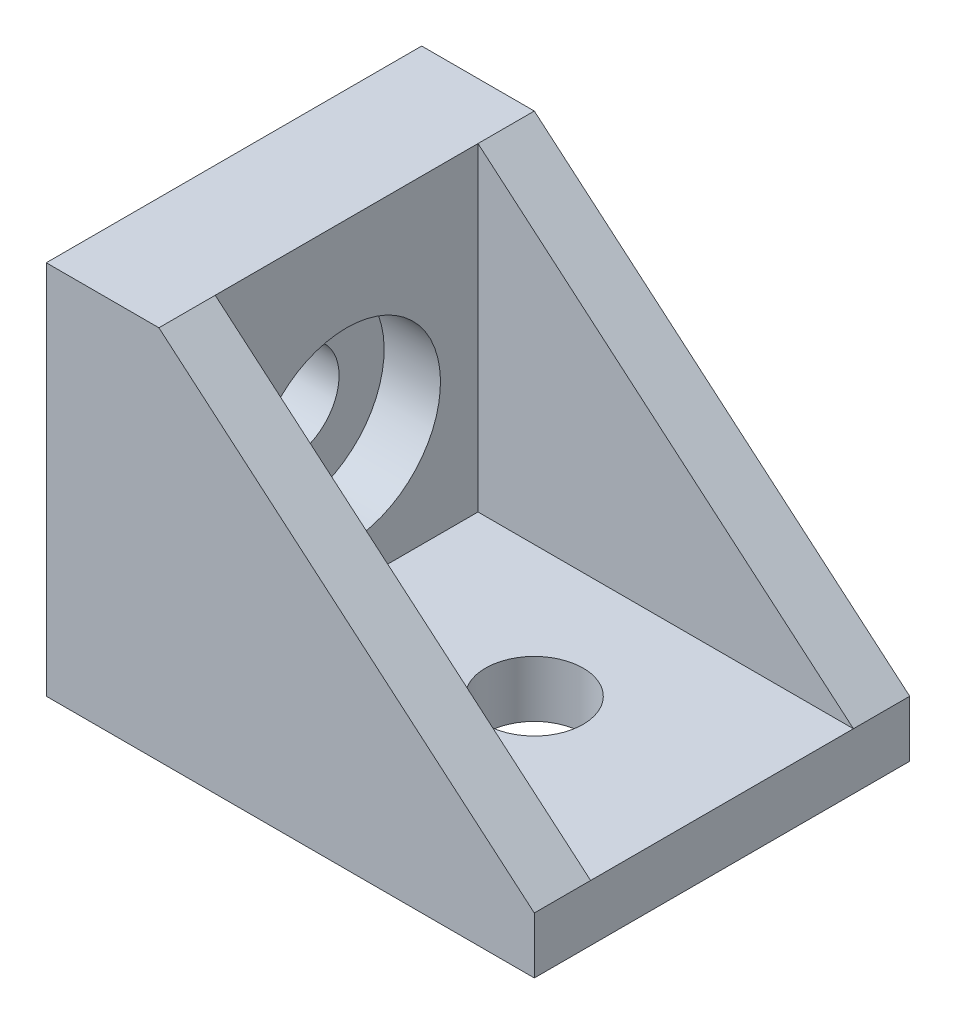
ISO-10303-21;
HEADER;
FILE_DESCRIPTION(('STEP AP214'),'2;1');
FILE_NAME('part.step','',(''),(''),'','','');
FILE_SCHEMA(('AUTOMOTIVE_DESIGN { 1 0 10303 214 1 1 1 1 }'));
ENDSEC;
DATA;
#1=APPLICATION_CONTEXT('core data for automotive mechanical design processes');
#2=APPLICATION_PROTOCOL_DEFINITION('international standard','automotive_design',2000,#1);
#3=PRODUCT_CONTEXT('',#1,'mechanical');
#4=PRODUCT('Part','Part','',(#3));
#5=PRODUCT_RELATED_PRODUCT_CATEGORY('part','',(#4));
#6=PRODUCT_DEFINITION_FORMATION('','',#4);
#7=PRODUCT_DEFINITION_CONTEXT('part definition',#1,'design');
#8=PRODUCT_DEFINITION('design','',#6,#7);
#9=PRODUCT_DEFINITION_SHAPE('','',#8);
#10=(LENGTH_UNIT() NAMED_UNIT(*) SI_UNIT(.MILLI.,.METRE.));
#11=(NAMED_UNIT(*) PLANE_ANGLE_UNIT() SI_UNIT($,.RADIAN.));
#12=(NAMED_UNIT(*) SI_UNIT($,.STERADIAN.) SOLID_ANGLE_UNIT());
#13=UNCERTAINTY_MEASURE_WITH_UNIT(LENGTH_MEASURE(1.E-05),#10,'distance_accuracy_value','');
#14=(GEOMETRIC_REPRESENTATION_CONTEXT(3) GLOBAL_UNCERTAINTY_ASSIGNED_CONTEXT((#13)) GLOBAL_UNIT_ASSIGNED_CONTEXT((#10,
#11,#12)) REPRESENTATION_CONTEXT('',''));
#15=CARTESIAN_POINT('',(0.,0.,0.));
#16=DIRECTION('',(0.,0.,1.));
#17=DIRECTION('',(1.,0.,0.));
#18=AXIS2_PLACEMENT_3D('',#15,#16,#17);
#19=CARTESIAN_POINT('',(6.,0.,-20.));
#20=DIRECTION('',(-1.,0.,0.));
#21=DIRECTION('',(0.,-1.,0.));
#22=AXIS2_PLACEMENT_3D('',#19,#20,#21);
#23=PLANE('',#22);
#24=CARTESIAN_POINT('',(6.,10.,-10.));
#25=DIRECTION('',(1.,0.,0.));
#26=DIRECTION('',(0.,1.,0.));
#27=AXIS2_PLACEMENT_3D('',#24,#25,#26);
#28=CIRCLE('',#27,5.);
#29=CARTESIAN_POINT('',(6.,15.,-10.));
#30=VERTEX_POINT('',#29);
#31=EDGE_CURVE('E124',#30,#30,#28,.T.);
#32=ORIENTED_EDGE('',*,*,#31,.F.);
#33=EDGE_LOOP('',(#32));
#34=FACE_BOUND('',#33,.T.);
#35=DIRECTION('',(0.,0.,1.));
#36=VECTOR('',#35,1.);
#37=CARTESIAN_POINT('',(6.,3.,-20.));
#38=LINE('',#37,#36);
#39=CARTESIAN_POINT('',(6.,3.,-17.));
#40=VERTEX_POINT('',#39);
#41=CARTESIAN_POINT('',(6.,3.,-3.));
#42=VERTEX_POINT('',#41);
#43=EDGE_CURVE('E129',#40,#42,#38,.T.);
#44=ORIENTED_EDGE('',*,*,#43,.F.);
#45=DIRECTION('',(0.,1.,0.));
#46=VECTOR('',#45,1.);
#47=CARTESIAN_POINT('',(6.,3.,-17.));
#48=LINE('',#47,#46);
#49=CARTESIAN_POINT('',(6.,20.,-17.));
#50=VERTEX_POINT('',#49);
#51=EDGE_CURVE('E172',#40,#50,#48,.T.);
#52=ORIENTED_EDGE('',*,*,#51,.T.);
#53=DIRECTION('',(0.,0.,1.));
#54=VECTOR('',#53,1.);
#55=CARTESIAN_POINT('',(6.,20.,-20.));
#56=LINE('',#55,#54);
#57=CARTESIAN_POINT('',(6.,20.,-3.));
#58=VERTEX_POINT('',#57);
#59=EDGE_CURVE('E109',#50,#58,#56,.T.);
#60=ORIENTED_EDGE('',*,*,#59,.T.);
#61=DIRECTION('',(0.,-1.,0.));
#62=VECTOR('',#61,1.);
#63=CARTESIAN_POINT('',(6.,3.,-3.));
#64=LINE('',#63,#62);
#65=EDGE_CURVE('E171',#58,#42,#64,.T.);
#66=ORIENTED_EDGE('',*,*,#65,.T.);
#67=EDGE_LOOP('',(#44,#52,#60,#66));
#68=FACE_BOUND('',#67,.T.);
#69=ADVANCED_FACE('F39',(#34,#68),#23,.F.);
#70=CARTESIAN_POINT('',(0.,3.,0.));
#71=DIRECTION('',(0.,1.,0.));
#72=DIRECTION('',(0.,0.,1.));
#73=AXIS2_PLACEMENT_3D('',#70,#71,#72);
#74=PLANE('',#73);
#75=DIRECTION('',(-1.,0.,0.));
#76=VECTOR('',#75,1.);
#77=CARTESIAN_POINT('',(26.,3.,-17.));
#78=LINE('',#77,#76);
#79=CARTESIAN_POINT('',(26.,3.,-17.));
#80=VERTEX_POINT('',#79);
#81=EDGE_CURVE('E189',#80,#40,#78,.T.);
#82=ORIENTED_EDGE('',*,*,#81,.T.);
#83=ORIENTED_EDGE('',*,*,#43,.T.);
#84=DIRECTION('',(1.,0.,0.));
#85=VECTOR('',#84,1.);
#86=CARTESIAN_POINT('',(26.,3.,-3.));
#87=LINE('',#86,#85);
#88=CARTESIAN_POINT('',(26.,3.,-3.));
#89=VERTEX_POINT('',#88);
#90=EDGE_CURVE('E176',#42,#89,#87,.T.);
#91=ORIENTED_EDGE('',*,*,#90,.T.);
#92=DIRECTION('',(0.,0.,1.));
#93=VECTOR('',#92,1.);
#94=CARTESIAN_POINT('',(26.,3.,0.));
#95=LINE('',#94,#93);
#96=EDGE_CURVE('E146',#80,#89,#95,.T.);
#97=ORIENTED_EDGE('',*,*,#96,.F.);
#98=EDGE_LOOP('',(#82,#83,#91,#97));
#99=FACE_BOUND('',#98,.T.);
#100=CARTESIAN_POINT('',(16.,3.,-10.));
#101=DIRECTION('',(0.,1.,0.));
#102=DIRECTION('',(0.,0.,1.));
#103=AXIS2_PLACEMENT_3D('',#100,#101,#102);
#104=CIRCLE('',#103,2.6);
#105=CARTESIAN_POINT('',(16.,3.,-7.4));
#106=VERTEX_POINT('',#105);
#107=EDGE_CURVE('E137',#106,#106,#104,.T.);
#108=ORIENTED_EDGE('',*,*,#107,.F.);
#109=EDGE_LOOP('',(#108));
#110=FACE_BOUND('',#109,.T.);
#111=ADVANCED_FACE('F232',(#99,#110),#74,.T.);
#112=CARTESIAN_POINT('',(20.,10.,-10.));
#113=DIRECTION('',(-1.,0.,0.));
#114=DIRECTION('',(0.,0.,1.));
#115=AXIS2_PLACEMENT_3D('',#112,#113,#114);
#116=CYLINDRICAL_SURFACE('',#115,2.6);
#117=CARTESIAN_POINT('',(0.,10.,-10.));
#118=DIRECTION('',(-1.,0.,0.));
#119=DIRECTION('',(0.,0.,1.));
#120=AXIS2_PLACEMENT_3D('',#117,#118,#119);
#121=CIRCLE('',#120,2.6);
#122=CARTESIAN_POINT('',(0.,10.,-7.4));
#123=VERTEX_POINT('',#122);
#124=EDGE_CURVE('E120',#123,#123,#121,.T.);
#125=ORIENTED_EDGE('',*,*,#124,.T.);
#126=EDGE_LOOP('',(#125));
#127=FACE_BOUND('',#126,.T.);
#128=CARTESIAN_POINT('',(3.,10.,-10.));
#129=DIRECTION('',(1.,0.,0.));
#130=DIRECTION('',(0.,1.,0.));
#131=AXIS2_PLACEMENT_3D('',#128,#129,#130);
#132=CIRCLE('',#131,2.6);
#133=CARTESIAN_POINT('',(3.,12.6,-10.));
#134=VERTEX_POINT('',#133);
#135=EDGE_CURVE('E43',#134,#134,#132,.F.);
#136=ORIENTED_EDGE('',*,*,#135,.F.);
#137=EDGE_LOOP('',(#136));
#138=FACE_BOUND('',#137,.T.);
#139=ADVANCED_FACE('F260',(#127,#138),#116,.F.);
#140=CARTESIAN_POINT('',(0.,20.,0.));
#141=DIRECTION('',(1.,0.,0.));
#142=DIRECTION('',(0.,0.,-1.));
#143=AXIS2_PLACEMENT_3D('',#140,#141,#142);
#144=PLANE('',#143);
#145=ORIENTED_EDGE('',*,*,#124,.F.);
#146=EDGE_LOOP('',(#145));
#147=FACE_BOUND('',#146,.T.);
#148=DIRECTION('',(0.,0.,1.));
#149=VECTOR('',#148,1.);
#150=CARTESIAN_POINT('',(0.,0.,0.));
#151=LINE('',#150,#149);
#152=CARTESIAN_POINT('',(0.,0.,-20.));
#153=VERTEX_POINT('',#152);
#154=CARTESIAN_POINT('',(0.,0.,0.));
#155=VERTEX_POINT('',#154);
#156=EDGE_CURVE('E97',#153,#155,#151,.T.);
#157=ORIENTED_EDGE('',*,*,#156,.T.);
#158=DIRECTION('',(0.,-1.,0.));
#159=VECTOR('',#158,1.);
#160=CARTESIAN_POINT('',(0.,20.,0.));
#161=LINE('',#160,#159);
#162=CARTESIAN_POINT('',(0.,20.,0.));
#163=VERTEX_POINT('',#162);
#164=EDGE_CURVE('E11',#163,#155,#161,.T.);
#165=ORIENTED_EDGE('',*,*,#164,.F.);
#166=DIRECTION('',(0.,0.,1.));
#167=VECTOR('',#166,1.);
#168=CARTESIAN_POINT('',(0.,20.,0.));
#169=LINE('',#168,#167);
#170=CARTESIAN_POINT('',(0.,20.,-20.));
#171=VERTEX_POINT('',#170);
#172=EDGE_CURVE('E91',#171,#163,#169,.T.);
#173=ORIENTED_EDGE('',*,*,#172,.F.);
#174=DIRECTION('',(0.,-1.,0.));
#175=VECTOR('',#174,1.);
#176=CARTESIAN_POINT('',(0.,20.,-20.));
#177=LINE('',#176,#175);
#178=EDGE_CURVE('E49',#171,#153,#177,.T.);
#179=ORIENTED_EDGE('',*,*,#178,.T.);
#180=EDGE_LOOP('',(#157,#165,#173,#179));
#181=FACE_BOUND('',#180,.T.);
#182=ADVANCED_FACE('F41',(#147,#181),#144,.F.);
#183=CARTESIAN_POINT('',(0.,20.,0.));
#184=DIRECTION('',(0.,0.,-1.));
#185=DIRECTION('',(-1.,0.,0.));
#186=AXIS2_PLACEMENT_3D('',#183,#184,#185);
#187=PLANE('',#186);
#188=DIRECTION('',(1.,0.,0.));
#189=VECTOR('',#188,1.);
#190=CARTESIAN_POINT('',(0.,0.,0.));
#191=LINE('',#190,#189);
#192=CARTESIAN_POINT('',(26.,0.,0.));
#193=VERTEX_POINT('',#192);
#194=EDGE_CURVE('E92',#155,#193,#191,.T.);
#195=ORIENTED_EDGE('',*,*,#194,.T.);
#196=DIRECTION('',(0.,1.,0.));
#197=VECTOR('',#196,1.);
#198=CARTESIAN_POINT('',(26.,0.,0.));
#199=LINE('',#198,#197);
#200=CARTESIAN_POINT('',(26.,3.,0.));
#201=VERTEX_POINT('',#200);
#202=EDGE_CURVE('E136',#193,#201,#199,.T.);
#203=ORIENTED_EDGE('',*,*,#202,.T.);
#204=DIRECTION('',(-0.76193931775946,0.64764842009554,0.));
#205=VECTOR('',#204,1.);
#206=CARTESIAN_POINT('',(6.,20.,0.));
#207=LINE('',#206,#205);
#208=CARTESIAN_POINT('',(6.,20.,0.));
#209=VERTEX_POINT('',#208);
#210=EDGE_CURVE('E167',#201,#209,#207,.T.);
#211=ORIENTED_EDGE('',*,*,#210,.T.);
#212=DIRECTION('',(1.,0.,0.));
#213=VECTOR('',#212,1.);
#214=CARTESIAN_POINT('',(0.,20.,0.));
#215=LINE('',#214,#213);
#216=EDGE_CURVE('E114',#163,#209,#215,.T.);
#217=ORIENTED_EDGE('',*,*,#216,.F.);
#218=ORIENTED_EDGE('',*,*,#164,.T.);
#219=EDGE_LOOP('',(#195,#203,#211,#217,#218));
#220=FACE_BOUND('',#219,.T.);
#221=ADVANCED_FACE('F224',(#220),#187,.F.);
#222=CARTESIAN_POINT('',(0.,20.,-20.));
#223=DIRECTION('',(0.,0.,1.));
#224=DIRECTION('',(1.,0.,0.));
#225=AXIS2_PLACEMENT_3D('',#222,#223,#224);
#226=PLANE('',#225);
#227=DIRECTION('',(-1.,0.,0.));
#228=VECTOR('',#227,1.);
#229=CARTESIAN_POINT('',(0.,20.,-20.));
#230=LINE('',#229,#228);
#231=CARTESIAN_POINT('',(6.,20.,-20.));
#232=VERTEX_POINT('',#231);
#233=EDGE_CURVE('E65',#232,#171,#230,.T.);
#234=ORIENTED_EDGE('',*,*,#233,.F.);
#235=DIRECTION('',(0.761939317759459,-0.64764842009554,0.));
#236=VECTOR('',#235,1.);
#237=CARTESIAN_POINT('',(6.,20.,-20.));
#238=LINE('',#237,#236);
#239=CARTESIAN_POINT('',(26.,3.,-20.));
#240=VERTEX_POINT('',#239);
#241=EDGE_CURVE('E183',#232,#240,#238,.T.);
#242=ORIENTED_EDGE('',*,*,#241,.T.);
#243=DIRECTION('',(0.,1.,0.));
#244=VECTOR('',#243,1.);
#245=CARTESIAN_POINT('',(26.,0.,-20.));
#246=LINE('',#245,#244);
#247=CARTESIAN_POINT('',(26.,0.,-20.));
#248=VERTEX_POINT('',#247);
#249=EDGE_CURVE('E86',#248,#240,#246,.T.);
#250=ORIENTED_EDGE('',*,*,#249,.F.);
#251=DIRECTION('',(-1.,0.,0.));
#252=VECTOR('',#251,1.);
#253=CARTESIAN_POINT('',(0.,0.,-20.));
#254=LINE('',#253,#252);
#255=EDGE_CURVE('E79',#248,#153,#254,.T.);
#256=ORIENTED_EDGE('',*,*,#255,.T.);
#257=ORIENTED_EDGE('',*,*,#178,.F.);
#258=EDGE_LOOP('',(#234,#242,#250,#256,#257));
#259=FACE_BOUND('',#258,.T.);
#260=ADVANCED_FACE('F81',(#259),#226,.F.);
#261=CARTESIAN_POINT('',(0.,20.,0.));
#262=DIRECTION('',(0.,-1.,0.));
#263=DIRECTION('',(0.,0.,-1.));
#264=AXIS2_PLACEMENT_3D('',#261,#262,#263);
#265=PLANE('',#264);
#266=ORIENTED_EDGE('',*,*,#216,.T.);
#267=DIRECTION('',(0.,0.,1.));
#268=VECTOR('',#267,1.);
#269=CARTESIAN_POINT('',(6.,20.,-3.));
#270=LINE('',#269,#268);
#271=EDGE_CURVE('E142',#58,#209,#270,.T.);
#272=ORIENTED_EDGE('',*,*,#271,.F.);
#273=ORIENTED_EDGE('',*,*,#59,.F.);
#274=EDGE_CURVE('E104',#232,#50,#56,.T.);
#275=ORIENTED_EDGE('',*,*,#274,.F.);
#276=ORIENTED_EDGE('',*,*,#233,.T.);
#277=ORIENTED_EDGE('',*,*,#172,.T.);
#278=EDGE_LOOP('',(#266,#272,#273,#275,#276,#277));
#279=FACE_BOUND('',#278,.T.);
#280=ADVANCED_FACE('F221',(#279),#265,.F.);
#281=CARTESIAN_POINT('',(0.,0.,0.));
#282=DIRECTION('',(0.,-1.,0.));
#283=DIRECTION('',(0.,0.,-1.));
#284=AXIS2_PLACEMENT_3D('',#281,#282,#283);
#285=PLANE('',#284);
#286=DIRECTION('',(0.,0.,1.));
#287=VECTOR('',#286,1.);
#288=CARTESIAN_POINT('',(26.,0.,0.));
#289=LINE('',#288,#287);
#290=EDGE_CURVE('E149',#248,#193,#289,.T.);
#291=ORIENTED_EDGE('',*,*,#290,.T.);
#292=ORIENTED_EDGE('',*,*,#194,.F.);
#293=ORIENTED_EDGE('',*,*,#156,.F.);
#294=ORIENTED_EDGE('',*,*,#255,.F.);
#295=EDGE_LOOP('',(#291,#292,#293,#294));
#296=FACE_BOUND('',#295,.T.);
#297=CARTESIAN_POINT('',(16.,0.,-10.));
#298=DIRECTION('',(0.,1.,0.));
#299=DIRECTION('',(0.,0.,1.));
#300=AXIS2_PLACEMENT_3D('',#297,#298,#299);
#301=CIRCLE('',#300,2.6);
#302=CARTESIAN_POINT('',(16.,0.,-7.4));
#303=VERTEX_POINT('',#302);
#304=EDGE_CURVE('E141',#303,#303,#301,.T.);
#305=ORIENTED_EDGE('',*,*,#304,.T.);
#306=EDGE_LOOP('',(#305));
#307=FACE_BOUND('',#306,.T.);
#308=ADVANCED_FACE('F100',(#296,#307),#285,.T.);
#309=CARTESIAN_POINT('',(3.,10.,-10.));
#310=DIRECTION('',(1.,0.,0.));
#311=DIRECTION('',(0.,1.,0.));
#312=AXIS2_PLACEMENT_3D('',#309,#310,#311);
#313=PLANE('',#312);
#314=CARTESIAN_POINT('',(3.,10.,-10.));
#315=DIRECTION('',(1.,0.,0.));
#316=DIRECTION('',(0.,1.,0.));
#317=AXIS2_PLACEMENT_3D('',#314,#315,#316);
#318=CIRCLE('',#317,5.);
#319=CARTESIAN_POINT('',(3.,15.,-10.));
#320=VERTEX_POINT('',#319);
#321=EDGE_CURVE('E128',#320,#320,#318,.T.);
#322=ORIENTED_EDGE('',*,*,#321,.T.);
#323=EDGE_LOOP('',(#322));
#324=FACE_BOUND('',#323,.T.);
#325=ORIENTED_EDGE('',*,*,#135,.T.);
#326=EDGE_LOOP('',(#325));
#327=FACE_BOUND('',#326,.T.);
#328=ADVANCED_FACE('F270',(#324,#327),#313,.T.);
#329=CARTESIAN_POINT('',(3.,10.,-10.));
#330=DIRECTION('',(1.,0.,0.));
#331=DIRECTION('',(0.,1.,0.));
#332=AXIS2_PLACEMENT_3D('',#329,#330,#331);
#333=CYLINDRICAL_SURFACE('',#332,5.);
#334=ORIENTED_EDGE('',*,*,#321,.F.);
#335=EDGE_LOOP('',(#334));
#336=FACE_BOUND('',#335,.T.);
#337=ORIENTED_EDGE('',*,*,#31,.T.);
#338=EDGE_LOOP('',(#337));
#339=FACE_BOUND('',#338,.T.);
#340=ADVANCED_FACE('F286',(#336,#339),#333,.F.);
#341=CARTESIAN_POINT('',(16.,0.,-10.));
#342=DIRECTION('',(0.,1.,0.));
#343=DIRECTION('',(0.,0.,1.));
#344=AXIS2_PLACEMENT_3D('',#341,#342,#343);
#345=CYLINDRICAL_SURFACE('',#344,2.6);
#346=ORIENTED_EDGE('',*,*,#304,.F.);
#347=EDGE_LOOP('',(#346));
#348=FACE_BOUND('',#347,.T.);
#349=ORIENTED_EDGE('',*,*,#107,.T.);
#350=EDGE_LOOP('',(#349));
#351=FACE_BOUND('',#350,.T.);
#352=ADVANCED_FACE('F292',(#348,#351),#345,.F.);
#353=CARTESIAN_POINT('',(26.,0.,0.));
#354=DIRECTION('',(-1.,0.,0.));
#355=DIRECTION('',(0.,0.,1.));
#356=AXIS2_PLACEMENT_3D('',#353,#354,#355);
#357=PLANE('',#356);
#358=EDGE_CURVE('E153',#240,#80,#95,.T.);
#359=ORIENTED_EDGE('',*,*,#358,.T.);
#360=ORIENTED_EDGE('',*,*,#96,.T.);
#361=DIRECTION('',(0.,0.,1.));
#362=VECTOR('',#361,1.);
#363=CARTESIAN_POINT('',(26.,3.,-3.));
#364=LINE('',#363,#362);
#365=EDGE_CURVE('E159',#89,#201,#364,.T.);
#366=ORIENTED_EDGE('',*,*,#365,.T.);
#367=ORIENTED_EDGE('',*,*,#202,.F.);
#368=ORIENTED_EDGE('',*,*,#290,.F.);
#369=ORIENTED_EDGE('',*,*,#249,.T.);
#370=EDGE_LOOP('',(#359,#360,#366,#367,#368,#369));
#371=FACE_BOUND('',#370,.T.);
#372=ADVANCED_FACE('F227',(#371),#357,.F.);
#373=CARTESIAN_POINT('',(6.,20.,-3.));
#374=DIRECTION('',(0.64764842009554,0.761939317759459,0.));
#375=DIRECTION('',(-0.761939317759459,0.64764842009554,0.));
#376=AXIS2_PLACEMENT_3D('',#373,#374,#375);
#377=PLANE('',#376);
#378=ORIENTED_EDGE('',*,*,#210,.F.);
#379=ORIENTED_EDGE('',*,*,#365,.F.);
#380=DIRECTION('',(-0.76193931775946,0.64764842009554,0.));
#381=VECTOR('',#380,1.);
#382=CARTESIAN_POINT('',(6.,20.,-3.));
#383=LINE('',#382,#381);
#384=EDGE_CURVE('E163',#89,#58,#383,.T.);
#385=ORIENTED_EDGE('',*,*,#384,.T.);
#386=ORIENTED_EDGE('',*,*,#271,.T.);
#387=EDGE_LOOP('',(#378,#379,#385,#386));
#388=FACE_BOUND('',#387,.T.);
#389=ADVANCED_FACE('F219',(#388),#377,.T.);
#390=CARTESIAN_POINT('',(0.,0.,-3.));
#391=DIRECTION('',(0.,0.,1.));
#392=DIRECTION('',(1.,0.,0.));
#393=AXIS2_PLACEMENT_3D('',#390,#391,#392);
#394=PLANE('',#393);
#395=ORIENTED_EDGE('',*,*,#65,.F.);
#396=ORIENTED_EDGE('',*,*,#384,.F.);
#397=ORIENTED_EDGE('',*,*,#90,.F.);
#398=EDGE_LOOP('',(#395,#396,#397));
#399=FACE_BOUND('',#398,.T.);
#400=ADVANCED_FACE('F215',(#399),#394,.F.);
#401=CARTESIAN_POINT('',(6.,20.,-17.));
#402=DIRECTION('',(0.64764842009554,0.761939317759459,0.));
#403=DIRECTION('',(-0.76193931775946,0.64764842009554,0.));
#404=AXIS2_PLACEMENT_3D('',#401,#402,#403);
#405=PLANE('',#404);
#406=ORIENTED_EDGE('',*,*,#241,.F.);
#407=ORIENTED_EDGE('',*,*,#274,.T.);
#408=DIRECTION('',(0.761939317759459,-0.64764842009554,0.));
#409=VECTOR('',#408,1.);
#410=CARTESIAN_POINT('',(6.,20.,-17.));
#411=LINE('',#410,#409);
#412=EDGE_CURVE('E56',#50,#80,#411,.T.);
#413=ORIENTED_EDGE('',*,*,#412,.T.);
#414=ORIENTED_EDGE('',*,*,#358,.F.);
#415=EDGE_LOOP('',(#406,#407,#413,#414));
#416=FACE_BOUND('',#415,.T.);
#417=ADVANCED_FACE('F246',(#416),#405,.T.);
#418=CARTESIAN_POINT('',(0.,0.,-17.));
#419=DIRECTION('',(0.,0.,1.));
#420=DIRECTION('',(1.,0.,0.));
#421=AXIS2_PLACEMENT_3D('',#418,#419,#420);
#422=PLANE('',#421);
#423=ORIENTED_EDGE('',*,*,#412,.F.);
#424=ORIENTED_EDGE('',*,*,#51,.F.);
#425=ORIENTED_EDGE('',*,*,#81,.F.);
#426=EDGE_LOOP('',(#423,#424,#425));
#427=FACE_BOUND('',#426,.T.);
#428=ADVANCED_FACE('F247',(#427),#422,.T.);
#429=CLOSED_SHELL('',(#69,#111,#139,#182,#221,#260,#280,#308,#328,#340,#352,#372,#389,#400,#417,#428));
#430=MANIFOLD_SOLID_BREP('B2',#429);
#431=ADVANCED_BREP_SHAPE_REPRESENTATION('',(#18,#430),#14);
#432=SHAPE_DEFINITION_REPRESENTATION(#9,#431);
ENDSEC;
END-ISO-10303-21;
